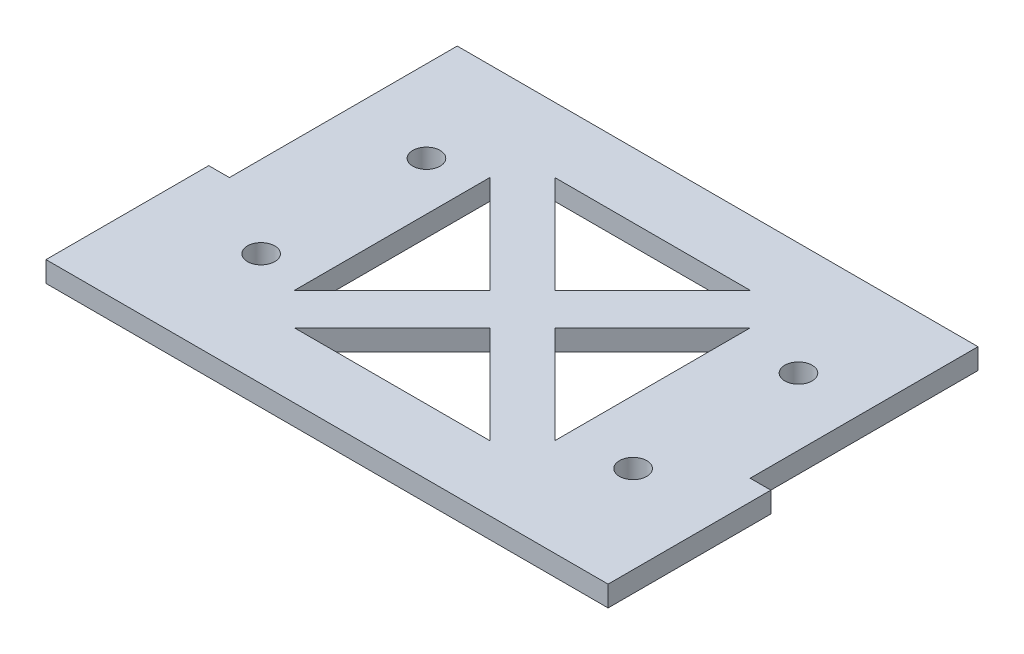
ISO-10303-21;
HEADER;
FILE_DESCRIPTION(('STEP AP214'),'2;1');
FILE_NAME('part.step','',(''),(''),'','','');
FILE_SCHEMA(('AUTOMOTIVE_DESIGN { 1 0 10303 214 1 1 1 1 }'));
ENDSEC;
DATA;
#1=APPLICATION_CONTEXT('core data for automotive mechanical design processes');
#2=APPLICATION_PROTOCOL_DEFINITION('international standard','automotive_design',2000,#1);
#3=PRODUCT_CONTEXT('',#1,'mechanical');
#4=PRODUCT('Part','Part','',(#3));
#5=PRODUCT_RELATED_PRODUCT_CATEGORY('part','',(#4));
#6=PRODUCT_DEFINITION_FORMATION('','',#4);
#7=PRODUCT_DEFINITION_CONTEXT('part definition',#1,'design');
#8=PRODUCT_DEFINITION('design','',#6,#7);
#9=PRODUCT_DEFINITION_SHAPE('','',#8);
#10=(LENGTH_UNIT() NAMED_UNIT(*) SI_UNIT(.MILLI.,.METRE.));
#11=(NAMED_UNIT(*) PLANE_ANGLE_UNIT() SI_UNIT($,.RADIAN.));
#12=(NAMED_UNIT(*) SI_UNIT($,.STERADIAN.) SOLID_ANGLE_UNIT());
#13=UNCERTAINTY_MEASURE_WITH_UNIT(LENGTH_MEASURE(1.E-05),#10,'distance_accuracy_value','');
#14=(GEOMETRIC_REPRESENTATION_CONTEXT(3) GLOBAL_UNCERTAINTY_ASSIGNED_CONTEXT((#13)) GLOBAL_UNIT_ASSIGNED_CONTEXT((#10,
#11,#12)) REPRESENTATION_CONTEXT('',''));
#15=CARTESIAN_POINT('',(0.,0.,0.));
#16=DIRECTION('',(0.,0.,1.));
#17=DIRECTION('',(1.,0.,0.));
#18=AXIS2_PLACEMENT_3D('',#15,#16,#17);
#19=CARTESIAN_POINT('',(40.,3.175,0.));
#20=DIRECTION('',(1.,0.,0.));
#21=DIRECTION('',(0.,0.,-1.));
#22=AXIS2_PLACEMENT_3D('',#19,#20,#21);
#23=PLANE('',#22);
#24=DIRECTION('',(0.,0.,1.));
#25=VECTOR('',#24,1.);
#26=CARTESIAN_POINT('',(40.,0.,0.));
#27=LINE('',#26,#25);
#28=CARTESIAN_POINT('',(40.,0.,-30.));
#29=VERTEX_POINT('',#28);
#30=CARTESIAN_POINT('',(40.,0.,5.));
#31=VERTEX_POINT('',#30);
#32=EDGE_CURVE('E343',#29,#31,#27,.T.);
#33=ORIENTED_EDGE('',*,*,#32,.F.);
#34=DIRECTION('',(0.,-1.,0.));
#35=VECTOR('',#34,1.);
#36=CARTESIAN_POINT('',(40.,3.175,-30.));
#37=LINE('',#36,#35);
#38=CARTESIAN_POINT('',(40.,3.175,-30.));
#39=VERTEX_POINT('',#38);
#40=EDGE_CURVE('E11',#39,#29,#37,.T.);
#41=ORIENTED_EDGE('',*,*,#40,.F.);
#42=DIRECTION('',(0.,0.,1.));
#43=VECTOR('',#42,1.);
#44=CARTESIAN_POINT('',(40.,3.175,0.));
#45=LINE('',#44,#43);
#46=CARTESIAN_POINT('',(40.,3.175,5.));
#47=VERTEX_POINT('',#46);
#48=EDGE_CURVE('E347',#39,#47,#45,.T.);
#49=ORIENTED_EDGE('',*,*,#48,.T.);
#50=DIRECTION('',(0.,-1.,0.));
#51=VECTOR('',#50,1.);
#52=CARTESIAN_POINT('',(40.,3.175,5.));
#53=LINE('',#52,#51);
#54=EDGE_CURVE('E376',#47,#31,#53,.T.);
#55=ORIENTED_EDGE('',*,*,#54,.T.);
#56=EDGE_LOOP('',(#33,#41,#49,#55));
#57=FACE_BOUND('',#56,.T.);
#58=ADVANCED_FACE('F44',(#57),#23,.T.);
#59=CARTESIAN_POINT('',(0.,3.175,-30.));
#60=DIRECTION('',(0.,0.,-1.));
#61=DIRECTION('',(-1.,0.,0.));
#62=AXIS2_PLACEMENT_3D('',#59,#60,#61);
#63=PLANE('',#62);
#64=DIRECTION('',(1.,0.,0.));
#65=VECTOR('',#64,1.);
#66=CARTESIAN_POINT('',(0.,0.,-30.));
#67=LINE('',#66,#65);
#68=CARTESIAN_POINT('',(-40.,0.,-30.));
#69=VERTEX_POINT('',#68);
#70=EDGE_CURVE('E380',#69,#29,#67,.T.);
#71=ORIENTED_EDGE('',*,*,#70,.F.);
#72=DIRECTION('',(0.,-1.,0.));
#73=VECTOR('',#72,1.);
#74=CARTESIAN_POINT('',(-40.,3.175,-30.));
#75=LINE('',#74,#73);
#76=CARTESIAN_POINT('',(-40.,3.175,-30.));
#77=VERTEX_POINT('',#76);
#78=EDGE_CURVE('E52',#77,#69,#75,.T.);
#79=ORIENTED_EDGE('',*,*,#78,.F.);
#80=DIRECTION('',(1.,0.,0.));
#81=VECTOR('',#80,1.);
#82=CARTESIAN_POINT('',(0.,3.175,-30.));
#83=LINE('',#82,#81);
#84=EDGE_CURVE('E351',#77,#39,#83,.T.);
#85=ORIENTED_EDGE('',*,*,#84,.T.);
#86=ORIENTED_EDGE('',*,*,#40,.T.);
#87=EDGE_LOOP('',(#71,#79,#85,#86));
#88=FACE_BOUND('',#87,.T.);
#89=ADVANCED_FACE('F435',(#88),#63,.T.);
#90=CARTESIAN_POINT('',(-40.,3.175,0.));
#91=DIRECTION('',(1.,0.,0.));
#92=DIRECTION('',(0.,0.,-1.));
#93=AXIS2_PLACEMENT_3D('',#90,#91,#92);
#94=PLANE('',#93);
#95=DIRECTION('',(0.,0.,1.));
#96=VECTOR('',#95,1.);
#97=CARTESIAN_POINT('',(-40.,0.,0.));
#98=LINE('',#97,#96);
#99=CARTESIAN_POINT('',(-40.,0.,5.00000000000002));
#100=VERTEX_POINT('',#99);
#101=EDGE_CURVE('E384',#69,#100,#98,.T.);
#102=ORIENTED_EDGE('',*,*,#101,.T.);
#103=DIRECTION('',(0.,-1.,0.));
#104=VECTOR('',#103,1.);
#105=CARTESIAN_POINT('',(-40.,3.175,5.00000000000002));
#106=LINE('',#105,#104);
#107=CARTESIAN_POINT('',(-40.,3.175,5.00000000000002));
#108=VERTEX_POINT('',#107);
#109=EDGE_CURVE('E421',#108,#100,#106,.T.);
#110=ORIENTED_EDGE('',*,*,#109,.F.);
#111=DIRECTION('',(0.,0.,1.));
#112=VECTOR('',#111,1.);
#113=CARTESIAN_POINT('',(-40.,3.175,0.));
#114=LINE('',#113,#112);
#115=EDGE_CURVE('E356',#77,#108,#114,.T.);
#116=ORIENTED_EDGE('',*,*,#115,.F.);
#117=ORIENTED_EDGE('',*,*,#78,.T.);
#118=EDGE_LOOP('',(#102,#110,#116,#117));
#119=FACE_BOUND('',#118,.T.);
#120=ADVANCED_FACE('F427',(#119),#94,.F.);
#121=CARTESIAN_POINT('',(0.,3.175,5.00000000000006));
#122=DIRECTION('',(0.,0.,-1.));
#123=DIRECTION('',(-1.,0.,0.));
#124=AXIS2_PLACEMENT_3D('',#121,#122,#123);
#125=PLANE('',#124);
#126=DIRECTION('',(1.,0.,0.));
#127=VECTOR('',#126,1.);
#128=CARTESIAN_POINT('',(0.,0.,5.00000000000006));
#129=LINE('',#128,#127);
#130=CARTESIAN_POINT('',(-43.175,0.,5.00000000000001));
#131=VERTEX_POINT('',#130);
#132=EDGE_CURVE('E388',#131,#100,#129,.T.);
#133=ORIENTED_EDGE('',*,*,#132,.F.);
#134=DIRECTION('',(0.,-1.,0.));
#135=VECTOR('',#134,1.);
#136=CARTESIAN_POINT('',(-43.175,3.175,5.00000000000001));
#137=LINE('',#136,#135);
#138=CARTESIAN_POINT('',(-43.175,3.175,5.00000000000001));
#139=VERTEX_POINT('',#138);
#140=EDGE_CURVE('E418',#139,#131,#137,.T.);
#141=ORIENTED_EDGE('',*,*,#140,.F.);
#142=DIRECTION('',(1.,0.,0.));
#143=VECTOR('',#142,1.);
#144=CARTESIAN_POINT('',(0.,3.175,5.00000000000006));
#145=LINE('',#144,#143);
#146=EDGE_CURVE('E359',#139,#108,#145,.T.);
#147=ORIENTED_EDGE('',*,*,#146,.T.);
#148=ORIENTED_EDGE('',*,*,#109,.T.);
#149=EDGE_LOOP('',(#133,#141,#147,#148));
#150=FACE_BOUND('',#149,.T.);
#151=ADVANCED_FACE('F460',(#150),#125,.T.);
#152=CARTESIAN_POINT('',(-43.175,3.175,0.));
#153=DIRECTION('',(-1.,0.,0.));
#154=DIRECTION('',(0.,0.,1.));
#155=AXIS2_PLACEMENT_3D('',#152,#153,#154);
#156=PLANE('',#155);
#157=DIRECTION('',(0.,0.,-1.));
#158=VECTOR('',#157,1.);
#159=CARTESIAN_POINT('',(-43.175,0.,0.));
#160=LINE('',#159,#158);
#161=CARTESIAN_POINT('',(-43.175,0.,30.));
#162=VERTEX_POINT('',#161);
#163=EDGE_CURVE('E392',#162,#131,#160,.T.);
#164=ORIENTED_EDGE('',*,*,#163,.F.);
#165=DIRECTION('',(0.,-1.,0.));
#166=VECTOR('',#165,1.);
#167=CARTESIAN_POINT('',(-43.175,3.175,30.));
#168=LINE('',#167,#166);
#169=CARTESIAN_POINT('',(-43.175,3.175,30.));
#170=VERTEX_POINT('',#169);
#171=EDGE_CURVE('E415',#170,#162,#168,.T.);
#172=ORIENTED_EDGE('',*,*,#171,.F.);
#173=DIRECTION('',(0.,0.,-1.));
#174=VECTOR('',#173,1.);
#175=CARTESIAN_POINT('',(-43.175,3.175,0.));
#176=LINE('',#175,#174);
#177=EDGE_CURVE('E363',#170,#139,#176,.T.);
#178=ORIENTED_EDGE('',*,*,#177,.T.);
#179=ORIENTED_EDGE('',*,*,#140,.T.);
#180=EDGE_LOOP('',(#164,#172,#178,#179));
#181=FACE_BOUND('',#180,.T.);
#182=ADVANCED_FACE('F457',(#181),#156,.T.);
#183=CARTESIAN_POINT('',(0.,3.175,30.));
#184=DIRECTION('',(0.,0.,-1.));
#185=DIRECTION('',(-1.,0.,0.));
#186=AXIS2_PLACEMENT_3D('',#183,#184,#185);
#187=PLANE('',#186);
#188=DIRECTION('',(1.,0.,0.));
#189=VECTOR('',#188,1.);
#190=CARTESIAN_POINT('',(0.,0.,30.));
#191=LINE('',#190,#189);
#192=CARTESIAN_POINT('',(43.175,0.,30.));
#193=VERTEX_POINT('',#192);
#194=EDGE_CURVE('E396',#162,#193,#191,.T.);
#195=ORIENTED_EDGE('',*,*,#194,.T.);
#196=DIRECTION('',(0.,-1.,0.));
#197=VECTOR('',#196,1.);
#198=CARTESIAN_POINT('',(43.175,3.175,30.));
#199=LINE('',#198,#197);
#200=CARTESIAN_POINT('',(43.175,3.175,30.));
#201=VERTEX_POINT('',#200);
#202=EDGE_CURVE('E411',#201,#193,#199,.T.);
#203=ORIENTED_EDGE('',*,*,#202,.F.);
#204=DIRECTION('',(1.,0.,0.));
#205=VECTOR('',#204,1.);
#206=CARTESIAN_POINT('',(0.,3.175,30.));
#207=LINE('',#206,#205);
#208=EDGE_CURVE('E367',#170,#201,#207,.T.);
#209=ORIENTED_EDGE('',*,*,#208,.F.);
#210=ORIENTED_EDGE('',*,*,#171,.T.);
#211=EDGE_LOOP('',(#195,#203,#209,#210));
#212=FACE_BOUND('',#211,.T.);
#213=ADVANCED_FACE('F453',(#212),#187,.F.);
#214=CARTESIAN_POINT('',(43.175,3.175,0.));
#215=DIRECTION('',(-1.,0.,0.));
#216=DIRECTION('',(0.,0.,1.));
#217=AXIS2_PLACEMENT_3D('',#214,#215,#216);
#218=PLANE('',#217);
#219=DIRECTION('',(0.,0.,-1.));
#220=VECTOR('',#219,1.);
#221=CARTESIAN_POINT('',(43.175,0.,0.));
#222=LINE('',#221,#220);
#223=CARTESIAN_POINT('',(43.175,0.,5.));
#224=VERTEX_POINT('',#223);
#225=EDGE_CURVE('E399',#193,#224,#222,.T.);
#226=ORIENTED_EDGE('',*,*,#225,.T.);
#227=DIRECTION('',(0.,-1.,0.));
#228=VECTOR('',#227,1.);
#229=CARTESIAN_POINT('',(43.175,3.175,5.));
#230=LINE('',#229,#228);
#231=CARTESIAN_POINT('',(43.175,3.175,5.));
#232=VERTEX_POINT('',#231);
#233=EDGE_CURVE('E407',#232,#224,#230,.T.);
#234=ORIENTED_EDGE('',*,*,#233,.F.);
#235=DIRECTION('',(0.,0.,-1.));
#236=VECTOR('',#235,1.);
#237=CARTESIAN_POINT('',(43.175,3.175,0.));
#238=LINE('',#237,#236);
#239=EDGE_CURVE('E370',#201,#232,#238,.T.);
#240=ORIENTED_EDGE('',*,*,#239,.F.);
#241=ORIENTED_EDGE('',*,*,#202,.T.);
#242=EDGE_LOOP('',(#226,#234,#240,#241));
#243=FACE_BOUND('',#242,.T.);
#244=ADVANCED_FACE('F449',(#243),#218,.F.);
#245=CARTESIAN_POINT('',(0.,3.175,4.99999999999999));
#246=DIRECTION('',(0.,0.,1.));
#247=DIRECTION('',(1.,0.,0.));
#248=AXIS2_PLACEMENT_3D('',#245,#246,#247);
#249=PLANE('',#248);
#250=DIRECTION('',(-1.,0.,0.));
#251=VECTOR('',#250,1.);
#252=CARTESIAN_POINT('',(0.,0.,4.99999999999999));
#253=LINE('',#252,#251);
#254=EDGE_CURVE('E352',#224,#31,#253,.T.);
#255=ORIENTED_EDGE('',*,*,#254,.T.);
#256=ORIENTED_EDGE('',*,*,#54,.F.);
#257=DIRECTION('',(-1.,0.,0.));
#258=VECTOR('',#257,1.);
#259=CARTESIAN_POINT('',(0.,3.175,4.99999999999999));
#260=LINE('',#259,#258);
#261=EDGE_CURVE('E373',#232,#47,#260,.T.);
#262=ORIENTED_EDGE('',*,*,#261,.F.);
#263=ORIENTED_EDGE('',*,*,#233,.T.);
#264=EDGE_LOOP('',(#255,#256,#262,#263));
#265=FACE_BOUND('',#264,.T.);
#266=ADVANCED_FACE('F444',(#265),#249,.F.);
#267=CARTESIAN_POINT('',(0.,3.175,0.));
#268=DIRECTION('',(0.,1.,0.));
#269=DIRECTION('',(0.,0.,1.));
#270=AXIS2_PLACEMENT_3D('',#267,#268,#269);
#271=PLANE('',#270);
#272=DIRECTION('',(0.,0.,-1.));
#273=VECTOR('',#272,1.);
#274=CARTESIAN_POINT('',(20.,3.175,-15.));
#275=LINE('',#274,#273);
#276=CARTESIAN_POINT('',(20.,3.175,15.));
#277=VERTEX_POINT('',#276);
#278=CARTESIAN_POINT('',(20.,3.175,-15.));
#279=VERTEX_POINT('',#278);
#280=EDGE_CURVE('E59',#277,#279,#275,.T.);
#281=ORIENTED_EDGE('',*,*,#280,.F.);
#282=DIRECTION('',(0.707106781186548,0.,0.707106781186547));
#283=VECTOR('',#282,1.);
#284=CARTESIAN_POINT('',(20.,3.175,15.));
#285=LINE('',#284,#283);
#286=CARTESIAN_POINT('',(5.,3.175,0.));
#287=VERTEX_POINT('',#286);
#288=EDGE_CURVE('E229',#287,#277,#285,.T.);
#289=ORIENTED_EDGE('',*,*,#288,.F.);
#290=DIRECTION('',(-0.707106781186547,0.,0.707106781186548));
#291=VECTOR('',#290,1.);
#292=CARTESIAN_POINT('',(5.,3.175,0.));
#293=LINE('',#292,#291);
#294=EDGE_CURVE('E233',#279,#287,#293,.T.);
#295=ORIENTED_EDGE('',*,*,#294,.F.);
#296=EDGE_LOOP('',(#281,#289,#295));
#297=FACE_BOUND('',#296,.T.);
#298=DIRECTION('',(-1.,0.,0.));
#299=VECTOR('',#298,1.);
#300=CARTESIAN_POINT('',(-15.,3.175,-20.));
#301=LINE('',#300,#299);
#302=CARTESIAN_POINT('',(15.,3.175,-20.));
#303=VERTEX_POINT('',#302);
#304=CARTESIAN_POINT('',(-15.,3.175,-20.));
#305=VERTEX_POINT('',#304);
#306=EDGE_CURVE('E67',#303,#305,#301,.T.);
#307=ORIENTED_EDGE('',*,*,#306,.F.);
#308=DIRECTION('',(0.707106781186547,0.,-0.707106781186548));
#309=VECTOR('',#308,1.);
#310=CARTESIAN_POINT('',(15.,3.175,-20.));
#311=LINE('',#310,#309);
#312=CARTESIAN_POINT('',(0.,3.175,-5.));
#313=VERTEX_POINT('',#312);
#314=EDGE_CURVE('E260',#313,#303,#311,.T.);
#315=ORIENTED_EDGE('',*,*,#314,.F.);
#316=DIRECTION('',(0.707106781186547,0.,0.707106781186547));
#317=VECTOR('',#316,1.);
#318=CARTESIAN_POINT('',(0.,3.175,-5.));
#319=LINE('',#318,#317);
#320=EDGE_CURVE('E264',#305,#313,#319,.T.);
#321=ORIENTED_EDGE('',*,*,#320,.F.);
#322=EDGE_LOOP('',(#307,#315,#321));
#323=FACE_BOUND('',#322,.T.);
#324=DIRECTION('',(1.,0.,0.));
#325=VECTOR('',#324,1.);
#326=CARTESIAN_POINT('',(15.,3.175,20.));
#327=LINE('',#326,#325);
#328=CARTESIAN_POINT('',(-15.,3.175,20.));
#329=VERTEX_POINT('',#328);
#330=CARTESIAN_POINT('',(15.,3.175,20.));
#331=VERTEX_POINT('',#330);
#332=EDGE_CURVE('E183',#329,#331,#327,.T.);
#333=ORIENTED_EDGE('',*,*,#332,.F.);
#334=DIRECTION('',(-0.707106781186547,0.,0.707106781186548));
#335=VECTOR('',#334,1.);
#336=CARTESIAN_POINT('',(-15.,3.175,20.));
#337=LINE('',#336,#335);
#338=CARTESIAN_POINT('',(0.,3.175,5.));
#339=VERTEX_POINT('',#338);
#340=EDGE_CURVE('E193',#339,#329,#337,.T.);
#341=ORIENTED_EDGE('',*,*,#340,.F.);
#342=DIRECTION('',(-0.707106781186548,0.,-0.707106781186547));
#343=VECTOR('',#342,1.);
#344=CARTESIAN_POINT('',(0.,3.175,5.));
#345=LINE('',#344,#343);
#346=EDGE_CURVE('E200',#331,#339,#345,.T.);
#347=ORIENTED_EDGE('',*,*,#346,.F.);
#348=EDGE_LOOP('',(#333,#341,#347));
#349=FACE_BOUND('',#348,.T.);
#350=DIRECTION('',(0.707106781186547,0.,-0.707106781186547));
#351=VECTOR('',#350,1.);
#352=CARTESIAN_POINT('',(-5.,3.175,0.));
#353=LINE('',#352,#351);
#354=CARTESIAN_POINT('',(-20.,3.175,15.));
#355=VERTEX_POINT('',#354);
#356=CARTESIAN_POINT('',(-5.,3.175,0.));
#357=VERTEX_POINT('',#356);
#358=EDGE_CURVE('E271',#355,#357,#353,.T.);
#359=ORIENTED_EDGE('',*,*,#358,.F.);
#360=DIRECTION('',(0.,0.,1.));
#361=VECTOR('',#360,1.);
#362=CARTESIAN_POINT('',(-20.,3.175,15.));
#363=LINE('',#362,#361);
#364=CARTESIAN_POINT('',(-20.,3.175,-15.));
#365=VERTEX_POINT('',#364);
#366=EDGE_CURVE('E287',#365,#355,#363,.T.);
#367=ORIENTED_EDGE('',*,*,#366,.F.);
#368=DIRECTION('',(-0.707106781186547,0.,-0.707106781186547));
#369=VECTOR('',#368,1.);
#370=CARTESIAN_POINT('',(-20.,3.175,-15.));
#371=LINE('',#370,#369);
#372=EDGE_CURVE('E298',#357,#365,#371,.T.);
#373=ORIENTED_EDGE('',*,*,#372,.F.);
#374=EDGE_LOOP('',(#359,#367,#373));
#375=FACE_BOUND('',#374,.T.);
#376=CARTESIAN_POINT('',(29.72,3.175,12.7));
#377=DIRECTION('',(0.,1.,0.));
#378=DIRECTION('',(0.,0.,1.));
#379=AXIS2_PLACEMENT_3D('',#376,#377,#378);
#380=CIRCLE('',#379,2.1);
#381=CARTESIAN_POINT('',(29.72,3.175,14.8));
#382=VERTEX_POINT('',#381);
#383=EDGE_CURVE('E323',#382,#382,#380,.T.);
#384=ORIENTED_EDGE('',*,*,#383,.F.);
#385=EDGE_LOOP('',(#384));
#386=FACE_BOUND('',#385,.T.);
#387=CARTESIAN_POINT('',(-27.43,3.175,-12.7));
#388=DIRECTION('',(0.,1.,0.));
#389=DIRECTION('',(0.,0.,1.));
#390=AXIS2_PLACEMENT_3D('',#387,#388,#389);
#391=CIRCLE('',#390,2.1);
#392=CARTESIAN_POINT('',(-27.43,3.175,-10.6));
#393=VERTEX_POINT('',#392);
#394=EDGE_CURVE('E332',#393,#393,#391,.T.);
#395=ORIENTED_EDGE('',*,*,#394,.F.);
#396=EDGE_LOOP('',(#395));
#397=FACE_BOUND('',#396,.T.);
#398=CARTESIAN_POINT('',(-27.43,3.175,12.7));
#399=DIRECTION('',(0.,1.,0.));
#400=DIRECTION('',(0.,0.,1.));
#401=AXIS2_PLACEMENT_3D('',#398,#399,#400);
#402=CIRCLE('',#401,2.1);
#403=CARTESIAN_POINT('',(-27.43,3.175,14.8));
#404=VERTEX_POINT('',#403);
#405=EDGE_CURVE('E315',#404,#404,#402,.T.);
#406=ORIENTED_EDGE('',*,*,#405,.F.);
#407=EDGE_LOOP('',(#406));
#408=FACE_BOUND('',#407,.T.);
#409=CARTESIAN_POINT('',(29.72,3.175,-12.7));
#410=DIRECTION('',(0.,1.,0.));
#411=DIRECTION('',(0.,0.,1.));
#412=AXIS2_PLACEMENT_3D('',#409,#410,#411);
#413=CIRCLE('',#412,2.1);
#414=CARTESIAN_POINT('',(29.72,3.175,-10.6));
#415=VERTEX_POINT('',#414);
#416=EDGE_CURVE('E327',#415,#415,#413,.T.);
#417=ORIENTED_EDGE('',*,*,#416,.F.);
#418=EDGE_LOOP('',(#417));
#419=FACE_BOUND('',#418,.T.);
#420=ORIENTED_EDGE('',*,*,#48,.F.);
#421=ORIENTED_EDGE('',*,*,#84,.F.);
#422=ORIENTED_EDGE('',*,*,#115,.T.);
#423=ORIENTED_EDGE('',*,*,#146,.F.);
#424=ORIENTED_EDGE('',*,*,#177,.F.);
#425=ORIENTED_EDGE('',*,*,#208,.T.);
#426=ORIENTED_EDGE('',*,*,#239,.T.);
#427=ORIENTED_EDGE('',*,*,#261,.T.);
#428=EDGE_LOOP('',(#420,#421,#422,#423,#424,#425,#426,#427));
#429=FACE_BOUND('',#428,.T.);
#430=ADVANCED_FACE('F202',(#297,#323,#349,#375,#386,#397,#408,#419,#429),#271,.T.);
#431=CARTESIAN_POINT('',(0.,0.,0.));
#432=DIRECTION('',(0.,1.,0.));
#433=DIRECTION('',(0.,0.,1.));
#434=AXIS2_PLACEMENT_3D('',#431,#432,#433);
#435=PLANE('',#434);
#436=DIRECTION('',(0.707106781186548,0.,0.707106781186547));
#437=VECTOR('',#436,1.);
#438=CARTESIAN_POINT('',(20.,0.,15.));
#439=LINE('',#438,#437);
#440=CARTESIAN_POINT('',(5.,0.,0.));
#441=VERTEX_POINT('',#440);
#442=CARTESIAN_POINT('',(20.,0.,15.));
#443=VERTEX_POINT('',#442);
#444=EDGE_CURVE('E226',#441,#443,#439,.T.);
#445=ORIENTED_EDGE('',*,*,#444,.T.);
#446=DIRECTION('',(0.,0.,-1.));
#447=VECTOR('',#446,1.);
#448=CARTESIAN_POINT('',(20.,0.,-15.));
#449=LINE('',#448,#447);
#450=CARTESIAN_POINT('',(20.,0.,-15.));
#451=VERTEX_POINT('',#450);
#452=EDGE_CURVE('E234',#443,#451,#449,.T.);
#453=ORIENTED_EDGE('',*,*,#452,.T.);
#454=DIRECTION('',(-0.707106781186547,0.,0.707106781186548));
#455=VECTOR('',#454,1.);
#456=CARTESIAN_POINT('',(5.,0.,0.));
#457=LINE('',#456,#455);
#458=EDGE_CURVE('E244',#451,#441,#457,.T.);
#459=ORIENTED_EDGE('',*,*,#458,.T.);
#460=EDGE_LOOP('',(#445,#453,#459));
#461=FACE_BOUND('',#460,.T.);
#462=DIRECTION('',(0.707106781186547,0.,-0.707106781186548));
#463=VECTOR('',#462,1.);
#464=CARTESIAN_POINT('',(15.,0.,-20.));
#465=LINE('',#464,#463);
#466=CARTESIAN_POINT('',(0.,0.,-5.));
#467=VERTEX_POINT('',#466);
#468=CARTESIAN_POINT('',(15.,0.,-20.));
#469=VERTEX_POINT('',#468);
#470=EDGE_CURVE('E254',#467,#469,#465,.T.);
#471=ORIENTED_EDGE('',*,*,#470,.T.);
#472=DIRECTION('',(-1.,0.,0.));
#473=VECTOR('',#472,1.);
#474=CARTESIAN_POINT('',(-15.,0.,-20.));
#475=LINE('',#474,#473);
#476=CARTESIAN_POINT('',(-15.,0.,-20.));
#477=VERTEX_POINT('',#476);
#478=EDGE_CURVE('E265',#469,#477,#475,.T.);
#479=ORIENTED_EDGE('',*,*,#478,.T.);
#480=DIRECTION('',(0.707106781186547,0.,0.707106781186547));
#481=VECTOR('',#480,1.);
#482=CARTESIAN_POINT('',(0.,0.,-5.));
#483=LINE('',#482,#481);
#484=EDGE_CURVE('E275',#477,#467,#483,.T.);
#485=ORIENTED_EDGE('',*,*,#484,.T.);
#486=EDGE_LOOP('',(#471,#479,#485));
#487=FACE_BOUND('',#486,.T.);
#488=DIRECTION('',(-0.707106781186547,0.,0.707106781186548));
#489=VECTOR('',#488,1.);
#490=CARTESIAN_POINT('',(-15.,0.,20.));
#491=LINE('',#490,#489);
#492=CARTESIAN_POINT('',(0.,0.,5.));
#493=VERTEX_POINT('',#492);
#494=CARTESIAN_POINT('',(-15.,0.,20.));
#495=VERTEX_POINT('',#494);
#496=EDGE_CURVE('E213',#493,#495,#491,.T.);
#497=ORIENTED_EDGE('',*,*,#496,.T.);
#498=DIRECTION('',(1.,0.,0.));
#499=VECTOR('',#498,1.);
#500=CARTESIAN_POINT('',(15.,0.,20.));
#501=LINE('',#500,#499);
#502=CARTESIAN_POINT('',(15.,0.,20.));
#503=VERTEX_POINT('',#502);
#504=EDGE_CURVE('E186',#495,#503,#501,.T.);
#505=ORIENTED_EDGE('',*,*,#504,.T.);
#506=DIRECTION('',(-0.707106781186548,0.,-0.707106781186547));
#507=VECTOR('',#506,1.);
#508=CARTESIAN_POINT('',(0.,0.,5.));
#509=LINE('',#508,#507);
#510=EDGE_CURVE('E216',#503,#493,#509,.T.);
#511=ORIENTED_EDGE('',*,*,#510,.T.);
#512=EDGE_LOOP('',(#497,#505,#511));
#513=FACE_BOUND('',#512,.T.);
#514=DIRECTION('',(0.,0.,1.));
#515=VECTOR('',#514,1.);
#516=CARTESIAN_POINT('',(-20.,0.,15.));
#517=LINE('',#516,#515);
#518=CARTESIAN_POINT('',(-20.,0.,-15.));
#519=VERTEX_POINT('',#518);
#520=CARTESIAN_POINT('',(-20.,0.,15.));
#521=VERTEX_POINT('',#520);
#522=EDGE_CURVE('E291',#519,#521,#517,.T.);
#523=ORIENTED_EDGE('',*,*,#522,.T.);
#524=DIRECTION('',(0.707106781186547,0.,-0.707106781186547));
#525=VECTOR('',#524,1.);
#526=CARTESIAN_POINT('',(-5.,0.,0.));
#527=LINE('',#526,#525);
#528=CARTESIAN_POINT('',(-5.,0.,0.));
#529=VERTEX_POINT('',#528);
#530=EDGE_CURVE('E282',#521,#529,#527,.T.);
#531=ORIENTED_EDGE('',*,*,#530,.T.);
#532=DIRECTION('',(-0.707106781186547,0.,-0.707106781186547));
#533=VECTOR('',#532,1.);
#534=CARTESIAN_POINT('',(-20.,0.,-15.));
#535=LINE('',#534,#533);
#536=EDGE_CURVE('E286',#529,#519,#535,.T.);
#537=ORIENTED_EDGE('',*,*,#536,.T.);
#538=EDGE_LOOP('',(#523,#531,#537));
#539=FACE_BOUND('',#538,.T.);
#540=CARTESIAN_POINT('',(29.72,0.,12.7));
#541=DIRECTION('',(0.,1.,0.));
#542=DIRECTION('',(0.,0.,1.));
#543=AXIS2_PLACEMENT_3D('',#540,#541,#542);
#544=CIRCLE('',#543,2.1);
#545=CARTESIAN_POINT('',(29.72,0.,14.8));
#546=VERTEX_POINT('',#545);
#547=EDGE_CURVE('E328',#546,#546,#544,.T.);
#548=ORIENTED_EDGE('',*,*,#547,.T.);
#549=EDGE_LOOP('',(#548));
#550=FACE_BOUND('',#549,.T.);
#551=CARTESIAN_POINT('',(-27.43,0.,-12.7));
#552=DIRECTION('',(0.,1.,0.));
#553=DIRECTION('',(0.,0.,1.));
#554=AXIS2_PLACEMENT_3D('',#551,#552,#553);
#555=CIRCLE('',#554,2.1);
#556=CARTESIAN_POINT('',(-27.43,0.,-10.6));
#557=VERTEX_POINT('',#556);
#558=EDGE_CURVE('E319',#557,#557,#555,.T.);
#559=ORIENTED_EDGE('',*,*,#558,.T.);
#560=EDGE_LOOP('',(#559));
#561=FACE_BOUND('',#560,.T.);
#562=CARTESIAN_POINT('',(-27.43,0.,12.7));
#563=DIRECTION('',(0.,1.,0.));
#564=DIRECTION('',(0.,0.,1.));
#565=AXIS2_PLACEMENT_3D('',#562,#563,#564);
#566=CIRCLE('',#565,2.1);
#567=CARTESIAN_POINT('',(-27.43,0.,14.8));
#568=VERTEX_POINT('',#567);
#569=EDGE_CURVE('E308',#568,#568,#566,.T.);
#570=ORIENTED_EDGE('',*,*,#569,.T.);
#571=EDGE_LOOP('',(#570));
#572=FACE_BOUND('',#571,.T.);
#573=CARTESIAN_POINT('',(29.72,0.,-12.7));
#574=DIRECTION('',(0.,1.,0.));
#575=DIRECTION('',(0.,0.,1.));
#576=AXIS2_PLACEMENT_3D('',#573,#574,#575);
#577=CIRCLE('',#576,2.1);
#578=CARTESIAN_POINT('',(29.72,0.,-10.6));
#579=VERTEX_POINT('',#578);
#580=EDGE_CURVE('E339',#579,#579,#577,.T.);
#581=ORIENTED_EDGE('',*,*,#580,.T.);
#582=EDGE_LOOP('',(#581));
#583=FACE_BOUND('',#582,.T.);
#584=ORIENTED_EDGE('',*,*,#32,.T.);
#585=ORIENTED_EDGE('',*,*,#254,.F.);
#586=ORIENTED_EDGE('',*,*,#225,.F.);
#587=ORIENTED_EDGE('',*,*,#194,.F.);
#588=ORIENTED_EDGE('',*,*,#163,.T.);
#589=ORIENTED_EDGE('',*,*,#132,.T.);
#590=ORIENTED_EDGE('',*,*,#101,.F.);
#591=ORIENTED_EDGE('',*,*,#70,.T.);
#592=EDGE_LOOP('',(#584,#585,#586,#587,#588,#589,#590,#591));
#593=FACE_BOUND('',#592,.T.);
#594=ADVANCED_FACE('F433',(#461,#487,#513,#539,#550,#561,#572,#583,#593),#435,.F.);
#595=CARTESIAN_POINT('',(29.72,0.,-12.7));
#596=DIRECTION('',(0.,1.,0.));
#597=DIRECTION('',(0.,0.,1.));
#598=AXIS2_PLACEMENT_3D('',#595,#596,#597);
#599=CYLINDRICAL_SURFACE('',#598,2.1);
#600=ORIENTED_EDGE('',*,*,#580,.F.);
#601=EDGE_LOOP('',(#600));
#602=FACE_BOUND('',#601,.T.);
#603=ORIENTED_EDGE('',*,*,#416,.T.);
#604=EDGE_LOOP('',(#603));
#605=FACE_BOUND('',#604,.T.);
#606=ADVANCED_FACE('F469',(#602,#605),#599,.F.);
#607=CARTESIAN_POINT('',(-27.43,0.,12.7));
#608=DIRECTION('',(0.,1.,0.));
#609=DIRECTION('',(0.,0.,1.));
#610=AXIS2_PLACEMENT_3D('',#607,#608,#609);
#611=CYLINDRICAL_SURFACE('',#610,2.1);
#612=ORIENTED_EDGE('',*,*,#569,.F.);
#613=EDGE_LOOP('',(#612));
#614=FACE_BOUND('',#613,.T.);
#615=ORIENTED_EDGE('',*,*,#405,.T.);
#616=EDGE_LOOP('',(#615));
#617=FACE_BOUND('',#616,.T.);
#618=ADVANCED_FACE('F520',(#614,#617),#611,.F.);
#619=CARTESIAN_POINT('',(-27.43,0.,-12.7));
#620=DIRECTION('',(0.,1.,0.));
#621=DIRECTION('',(0.,0.,1.));
#622=AXIS2_PLACEMENT_3D('',#619,#620,#621);
#623=CYLINDRICAL_SURFACE('',#622,2.1);
#624=ORIENTED_EDGE('',*,*,#558,.F.);
#625=EDGE_LOOP('',(#624));
#626=FACE_BOUND('',#625,.T.);
#627=ORIENTED_EDGE('',*,*,#394,.T.);
#628=EDGE_LOOP('',(#627));
#629=FACE_BOUND('',#628,.T.);
#630=ADVANCED_FACE('F526',(#626,#629),#623,.F.);
#631=CARTESIAN_POINT('',(29.72,0.,12.7));
#632=DIRECTION('',(0.,1.,0.));
#633=DIRECTION('',(0.,0.,1.));
#634=AXIS2_PLACEMENT_3D('',#631,#632,#633);
#635=CYLINDRICAL_SURFACE('',#634,2.1);
#636=ORIENTED_EDGE('',*,*,#547,.F.);
#637=EDGE_LOOP('',(#636));
#638=FACE_BOUND('',#637,.T.);
#639=ORIENTED_EDGE('',*,*,#383,.T.);
#640=EDGE_LOOP('',(#639));
#641=FACE_BOUND('',#640,.T.);
#642=ADVANCED_FACE('F534',(#638,#641),#635,.F.);
#643=CARTESIAN_POINT('',(-5.,0.,0.));
#644=DIRECTION('',(0.707106781186548,0.,0.707106781186548));
#645=DIRECTION('',(0.707106781186548,0.,-0.707106781186548));
#646=AXIS2_PLACEMENT_3D('',#643,#644,#645);
#647=PLANE('',#646);
#648=ORIENTED_EDGE('',*,*,#358,.T.);
#649=DIRECTION('',(0.,1.,0.));
#650=VECTOR('',#649,1.);
#651=CARTESIAN_POINT('',(-5.,0.,0.));
#652=LINE('',#651,#650);
#653=EDGE_CURVE('E295',#529,#357,#652,.T.);
#654=ORIENTED_EDGE('',*,*,#653,.F.);
#655=ORIENTED_EDGE('',*,*,#530,.F.);
#656=DIRECTION('',(0.,1.,0.));
#657=VECTOR('',#656,1.);
#658=CARTESIAN_POINT('',(-20.,0.,15.));
#659=LINE('',#658,#657);
#660=EDGE_CURVE('E305',#521,#355,#659,.T.);
#661=ORIENTED_EDGE('',*,*,#660,.T.);
#662=EDGE_LOOP('',(#648,#654,#655,#661));
#663=FACE_BOUND('',#662,.T.);
#664=ADVANCED_FACE('F541',(#663),#647,.F.);
#665=CARTESIAN_POINT('',(-20.,0.,15.));
#666=DIRECTION('',(-1.,0.,0.));
#667=DIRECTION('',(0.,0.,1.));
#668=AXIS2_PLACEMENT_3D('',#665,#666,#667);
#669=PLANE('',#668);
#670=ORIENTED_EDGE('',*,*,#366,.T.);
#671=ORIENTED_EDGE('',*,*,#660,.F.);
#672=ORIENTED_EDGE('',*,*,#522,.F.);
#673=DIRECTION('',(0.,1.,0.));
#674=VECTOR('',#673,1.);
#675=CARTESIAN_POINT('',(-20.,0.,-15.));
#676=LINE('',#675,#674);
#677=EDGE_CURVE('E309',#519,#365,#676,.T.);
#678=ORIENTED_EDGE('',*,*,#677,.T.);
#679=EDGE_LOOP('',(#670,#671,#672,#678));
#680=FACE_BOUND('',#679,.T.);
#681=ADVANCED_FACE('F548',(#680),#669,.F.);
#682=CARTESIAN_POINT('',(-20.,0.,-15.));
#683=DIRECTION('',(0.707106781186548,0.,-0.707106781186548));
#684=DIRECTION('',(-0.707106781186548,0.,-0.707106781186548));
#685=AXIS2_PLACEMENT_3D('',#682,#683,#684);
#686=PLANE('',#685);
#687=ORIENTED_EDGE('',*,*,#372,.T.);
#688=ORIENTED_EDGE('',*,*,#677,.F.);
#689=ORIENTED_EDGE('',*,*,#536,.F.);
#690=ORIENTED_EDGE('',*,*,#653,.T.);
#691=EDGE_LOOP('',(#687,#688,#689,#690));
#692=FACE_BOUND('',#691,.T.);
#693=ADVANCED_FACE('F556',(#692),#686,.F.);
#694=CARTESIAN_POINT('',(15.,0.,20.));
#695=DIRECTION('',(0.,0.,1.));
#696=DIRECTION('',(1.,0.,0.));
#697=AXIS2_PLACEMENT_3D('',#694,#695,#696);
#698=PLANE('',#697);
#699=ORIENTED_EDGE('',*,*,#332,.T.);
#700=DIRECTION('',(0.,1.,0.));
#701=VECTOR('',#700,1.);
#702=CARTESIAN_POINT('',(15.,0.,20.));
#703=LINE('',#702,#701);
#704=EDGE_CURVE('E217',#503,#331,#703,.T.);
#705=ORIENTED_EDGE('',*,*,#704,.F.);
#706=ORIENTED_EDGE('',*,*,#504,.F.);
#707=DIRECTION('',(0.,1.,0.));
#708=VECTOR('',#707,1.);
#709=CARTESIAN_POINT('',(-15.,0.,20.));
#710=LINE('',#709,#708);
#711=EDGE_CURVE('E179',#495,#329,#710,.T.);
#712=ORIENTED_EDGE('',*,*,#711,.T.);
#713=EDGE_LOOP('',(#699,#705,#706,#712));
#714=FACE_BOUND('',#713,.T.);
#715=ADVANCED_FACE('F181',(#714),#698,.F.);
#716=CARTESIAN_POINT('',(-15.,0.,20.));
#717=DIRECTION('',(-0.707106781186548,0.,-0.707106781186547));
#718=DIRECTION('',(-0.707106781186547,0.,0.707106781186548));
#719=AXIS2_PLACEMENT_3D('',#716,#717,#718);
#720=PLANE('',#719);
#721=ORIENTED_EDGE('',*,*,#340,.T.);
#722=ORIENTED_EDGE('',*,*,#711,.F.);
#723=ORIENTED_EDGE('',*,*,#496,.F.);
#724=DIRECTION('',(0.,1.,0.));
#725=VECTOR('',#724,1.);
#726=CARTESIAN_POINT('',(0.,0.,5.));
#727=LINE('',#726,#725);
#728=EDGE_CURVE('E190',#493,#339,#727,.T.);
#729=ORIENTED_EDGE('',*,*,#728,.T.);
#730=EDGE_LOOP('',(#721,#722,#723,#729));
#731=FACE_BOUND('',#730,.T.);
#732=ADVANCED_FACE('F194',(#731),#720,.F.);
#733=CARTESIAN_POINT('',(0.,0.,5.));
#734=DIRECTION('',(0.707106781186547,0.,-0.707106781186548));
#735=DIRECTION('',(-0.707106781186548,0.,-0.707106781186547));
#736=AXIS2_PLACEMENT_3D('',#733,#734,#735);
#737=PLANE('',#736);
#738=ORIENTED_EDGE('',*,*,#346,.T.);
#739=ORIENTED_EDGE('',*,*,#728,.F.);
#740=ORIENTED_EDGE('',*,*,#510,.F.);
#741=ORIENTED_EDGE('',*,*,#704,.T.);
#742=EDGE_LOOP('',(#738,#739,#740,#741));
#743=FACE_BOUND('',#742,.T.);
#744=ADVANCED_FACE('F577',(#743),#737,.F.);
#745=CARTESIAN_POINT('',(-15.,0.,-20.));
#746=DIRECTION('',(0.,0.,-1.));
#747=DIRECTION('',(-1.,0.,0.));
#748=AXIS2_PLACEMENT_3D('',#745,#746,#747);
#749=PLANE('',#748);
#750=ORIENTED_EDGE('',*,*,#306,.T.);
#751=DIRECTION('',(0.,1.,0.));
#752=VECTOR('',#751,1.);
#753=CARTESIAN_POINT('',(-15.,0.,-20.));
#754=LINE('',#753,#752);
#755=EDGE_CURVE('E251',#477,#305,#754,.T.);
#756=ORIENTED_EDGE('',*,*,#755,.F.);
#757=ORIENTED_EDGE('',*,*,#478,.F.);
#758=DIRECTION('',(0.,1.,0.));
#759=VECTOR('',#758,1.);
#760=CARTESIAN_POINT('',(15.,0.,-20.));
#761=LINE('',#760,#759);
#762=EDGE_CURVE('E240',#469,#303,#761,.T.);
#763=ORIENTED_EDGE('',*,*,#762,.T.);
#764=EDGE_LOOP('',(#750,#756,#757,#763));
#765=FACE_BOUND('',#764,.T.);
#766=ADVANCED_FACE('F584',(#765),#749,.F.);
#767=CARTESIAN_POINT('',(15.,0.,-20.));
#768=DIRECTION('',(0.707106781186548,0.,0.707106781186547));
#769=DIRECTION('',(0.707106781186547,0.,-0.707106781186548));
#770=AXIS2_PLACEMENT_3D('',#767,#768,#769);
#771=PLANE('',#770);
#772=ORIENTED_EDGE('',*,*,#314,.T.);
#773=ORIENTED_EDGE('',*,*,#762,.F.);
#774=ORIENTED_EDGE('',*,*,#470,.F.);
#775=DIRECTION('',(0.,1.,0.));
#776=VECTOR('',#775,1.);
#777=CARTESIAN_POINT('',(0.,0.,-5.));
#778=LINE('',#777,#776);
#779=EDGE_CURVE('E255',#467,#313,#778,.T.);
#780=ORIENTED_EDGE('',*,*,#779,.T.);
#781=EDGE_LOOP('',(#772,#773,#774,#780));
#782=FACE_BOUND('',#781,.T.);
#783=ADVANCED_FACE('F592',(#782),#771,.F.);
#784=CARTESIAN_POINT('',(0.,0.,-5.));
#785=DIRECTION('',(-0.707106781186548,0.,0.707106781186548));
#786=DIRECTION('',(0.707106781186548,0.,0.707106781186548));
#787=AXIS2_PLACEMENT_3D('',#784,#785,#786);
#788=PLANE('',#787);
#789=ORIENTED_EDGE('',*,*,#320,.T.);
#790=ORIENTED_EDGE('',*,*,#779,.F.);
#791=ORIENTED_EDGE('',*,*,#484,.F.);
#792=ORIENTED_EDGE('',*,*,#755,.T.);
#793=EDGE_LOOP('',(#789,#790,#791,#792));
#794=FACE_BOUND('',#793,.T.);
#795=ADVANCED_FACE('F599',(#794),#788,.F.);
#796=CARTESIAN_POINT('',(20.,0.,-15.));
#797=DIRECTION('',(1.,0.,0.));
#798=DIRECTION('',(0.,0.,-1.));
#799=AXIS2_PLACEMENT_3D('',#796,#797,#798);
#800=PLANE('',#799);
#801=ORIENTED_EDGE('',*,*,#280,.T.);
#802=DIRECTION('',(0.,1.,0.));
#803=VECTOR('',#802,1.);
#804=CARTESIAN_POINT('',(20.,0.,-15.));
#805=LINE('',#804,#803);
#806=EDGE_CURVE('E223',#451,#279,#805,.T.);
#807=ORIENTED_EDGE('',*,*,#806,.F.);
#808=ORIENTED_EDGE('',*,*,#452,.F.);
#809=DIRECTION('',(0.,1.,0.));
#810=VECTOR('',#809,1.);
#811=CARTESIAN_POINT('',(20.,0.,15.));
#812=LINE('',#811,#810);
#813=EDGE_CURVE('E205',#443,#277,#812,.T.);
#814=ORIENTED_EDGE('',*,*,#813,.T.);
#815=EDGE_LOOP('',(#801,#807,#808,#814));
#816=FACE_BOUND('',#815,.T.);
#817=ADVANCED_FACE('F607',(#816),#800,.F.);
#818=CARTESIAN_POINT('',(20.,0.,15.));
#819=DIRECTION('',(-0.707106781186547,0.,0.707106781186548));
#820=DIRECTION('',(0.707106781186548,0.,0.707106781186547));
#821=AXIS2_PLACEMENT_3D('',#818,#819,#820);
#822=PLANE('',#821);
#823=ORIENTED_EDGE('',*,*,#288,.T.);
#824=ORIENTED_EDGE('',*,*,#813,.F.);
#825=ORIENTED_EDGE('',*,*,#444,.F.);
#826=DIRECTION('',(0.,1.,0.));
#827=VECTOR('',#826,1.);
#828=CARTESIAN_POINT('',(5.,0.,0.));
#829=LINE('',#828,#827);
#830=EDGE_CURVE('E209',#441,#287,#829,.T.);
#831=ORIENTED_EDGE('',*,*,#830,.T.);
#832=EDGE_LOOP('',(#823,#824,#825,#831));
#833=FACE_BOUND('',#832,.T.);
#834=ADVANCED_FACE('F615',(#833),#822,.F.);
#835=CARTESIAN_POINT('',(5.,0.,0.));
#836=DIRECTION('',(-0.707106781186548,0.,-0.707106781186547));
#837=DIRECTION('',(-0.707106781186547,0.,0.707106781186548));
#838=AXIS2_PLACEMENT_3D('',#835,#836,#837);
#839=PLANE('',#838);
#840=ORIENTED_EDGE('',*,*,#294,.T.);
#841=ORIENTED_EDGE('',*,*,#830,.F.);
#842=ORIENTED_EDGE('',*,*,#458,.F.);
#843=ORIENTED_EDGE('',*,*,#806,.T.);
#844=EDGE_LOOP('',(#840,#841,#842,#843));
#845=FACE_BOUND('',#844,.T.);
#846=ADVANCED_FACE('F622',(#845),#839,.F.);
#847=CLOSED_SHELL('',(#58,#89,#120,#151,#182,#213,#244,#266,#430,#594,#606,#618,#630,#642,#664,
#681,#693,#715,#732,#744,#766,#783,#795,#817,#834,#846));
#848=MANIFOLD_SOLID_BREP('B2',#847);
#849=ADVANCED_BREP_SHAPE_REPRESENTATION('',(#18,#848),#14);
#850=SHAPE_DEFINITION_REPRESENTATION(#9,#849);
ENDSEC;
END-ISO-10303-21;
